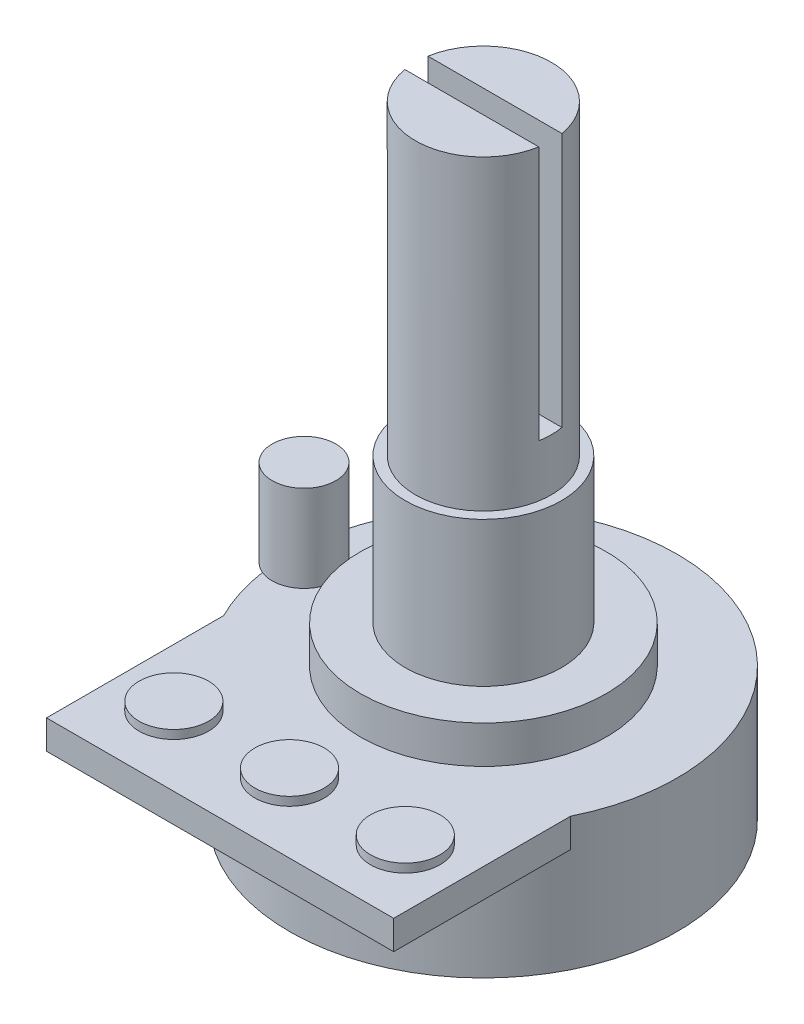
ISO-10303-21;
HEADER;
FILE_DESCRIPTION(('STEP AP214'),'2;1');
FILE_NAME('part.step','',(''),(''),'','','');
FILE_SCHEMA(('AUTOMOTIVE_DESIGN { 1 0 10303 214 1 1 1 1 }'));
ENDSEC;
DATA;
#1=APPLICATION_CONTEXT('core data for automotive mechanical design processes');
#2=APPLICATION_PROTOCOL_DEFINITION('international standard','automotive_design',2000,#1);
#3=PRODUCT_CONTEXT('',#1,'mechanical');
#4=PRODUCT('Part','Part','',(#3));
#5=PRODUCT_RELATED_PRODUCT_CATEGORY('part','',(#4));
#6=PRODUCT_DEFINITION_FORMATION('','',#4);
#7=PRODUCT_DEFINITION_CONTEXT('part definition',#1,'design');
#8=PRODUCT_DEFINITION('design','',#6,#7);
#9=PRODUCT_DEFINITION_SHAPE('','',#8);
#10=(LENGTH_UNIT() NAMED_UNIT(*) SI_UNIT(.MILLI.,.METRE.));
#11=(NAMED_UNIT(*) PLANE_ANGLE_UNIT() SI_UNIT($,.RADIAN.));
#12=(NAMED_UNIT(*) SI_UNIT($,.STERADIAN.) SOLID_ANGLE_UNIT());
#13=UNCERTAINTY_MEASURE_WITH_UNIT(LENGTH_MEASURE(1.E-05),#10,'distance_accuracy_value','');
#14=(GEOMETRIC_REPRESENTATION_CONTEXT(3) GLOBAL_UNCERTAINTY_ASSIGNED_CONTEXT((#13)) GLOBAL_UNIT_ASSIGNED_CONTEXT((#10,
#11,#12)) REPRESENTATION_CONTEXT('',''));
#15=CARTESIAN_POINT('',(0.,0.,0.));
#16=DIRECTION('',(0.,0.,1.));
#17=DIRECTION('',(1.,0.,0.));
#18=AXIS2_PLACEMENT_3D('',#15,#16,#17);
#19=CARTESIAN_POINT('',(0.,-7.493,0.));
#20=DIRECTION('',(0.,1.,0.));
#21=DIRECTION('',(0.,0.,1.));
#22=AXIS2_PLACEMENT_3D('',#19,#20,#21);
#23=CYLINDRICAL_SURFACE('',#22,8.509);
#24=CARTESIAN_POINT('',(0.,-7.493,0.));
#25=DIRECTION('',(0.,-1.,0.));
#26=DIRECTION('',(0.,0.,-1.));
#27=AXIS2_PLACEMENT_3D('',#24,#25,#26);
#28=CIRCLE('',#27,8.509);
#29=CARTESIAN_POINT('',(0.,-7.493,-8.509));
#30=VERTEX_POINT('',#29);
#31=EDGE_CURVE('E289',#30,#30,#28,.T.);
#32=ORIENTED_EDGE('',*,*,#31,.F.);
#33=EDGE_LOOP('',(#32));
#34=FACE_BOUND('',#33,.T.);
#35=DIRECTION('',(0.,-1.,0.));
#36=VECTOR('',#35,1.);
#37=CARTESIAN_POINT('',(4.82933360917362,-3.1115,7.00575605422471));
#38=LINE('',#37,#36);
#39=CARTESIAN_POINT('',(4.82933360917361,-3.302,7.00575605422471));
#40=VERTEX_POINT('',#39);
#41=CARTESIAN_POINT('',(4.82933360917362,-2.921,7.00575605422471));
#42=VERTEX_POINT('',#41);
#43=EDGE_CURVE('E199',#40,#42,#38,.F.);
#44=ORIENTED_EDGE('',*,*,#43,.F.);
#45=CARTESIAN_POINT('',(0.,-3.302,0.));
#46=DIRECTION('',(0.,1.,0.));
#47=DIRECTION('',(0.,0.,1.));
#48=AXIS2_PLACEMENT_3D('',#45,#46,#47);
#49=CIRCLE('',#48,8.509);
#50=CARTESIAN_POINT('',(3.87566228506189,-3.302,7.57511206861977));
#51=VERTEX_POINT('',#50);
#52=EDGE_CURVE('E46',#51,#40,#49,.T.);
#53=ORIENTED_EDGE('',*,*,#52,.F.);
#54=DIRECTION('',(0.,-1.,0.));
#55=VECTOR('',#54,1.);
#56=CARTESIAN_POINT('',(3.87566228506189,-3.1115,7.57511206861977));
#57=LINE('',#56,#55);
#58=CARTESIAN_POINT('',(3.87566228506189,-2.921,7.57511206861977));
#59=VERTEX_POINT('',#58);
#60=EDGE_CURVE('E197',#59,#51,#57,.T.);
#61=ORIENTED_EDGE('',*,*,#60,.F.);
#62=CARTESIAN_POINT('',(0.,-2.921,0.));
#63=DIRECTION('',(0.,-1.,0.));
#64=DIRECTION('',(0.,0.,-1.));
#65=AXIS2_PLACEMENT_3D('',#62,#63,#64);
#66=CIRCLE('',#65,8.509);
#67=CARTESIAN_POINT('',(1.51787676095231,-2.921,8.3725223880597));
#68=VERTEX_POINT('',#67);
#69=EDGE_CURVE('E306',#59,#68,#66,.T.);
#70=ORIENTED_EDGE('',*,*,#69,.T.);
#71=DIRECTION('',(0.,-1.,0.));
#72=VECTOR('',#71,1.);
#73=CARTESIAN_POINT('',(1.51787676095231,-3.1115,8.3725223880597));
#74=LINE('',#73,#72);
#75=CARTESIAN_POINT('',(1.51787676095231,-3.302,8.3725223880597));
#76=VERTEX_POINT('',#75);
#77=EDGE_CURVE('E206',#76,#68,#74,.F.);
#78=ORIENTED_EDGE('',*,*,#77,.F.);
#79=CARTESIAN_POINT('',(0.,-3.302,0.));
#80=DIRECTION('',(0.,1.,0.));
#81=DIRECTION('',(0.,0.,1.));
#82=AXIS2_PLACEMENT_3D('',#79,#80,#81);
#83=CIRCLE('',#82,8.509);
#84=CARTESIAN_POINT('',(-1.51787676095231,-3.302,8.3725223880597));
#85=VERTEX_POINT('',#84);
#86=EDGE_CURVE('E320',#85,#76,#83,.T.);
#87=ORIENTED_EDGE('',*,*,#86,.F.);
#88=DIRECTION('',(0.,-1.,0.));
#89=VECTOR('',#88,1.);
#90=CARTESIAN_POINT('',(-1.51787676095231,-3.1115,8.3725223880597));
#91=LINE('',#90,#89);
#92=CARTESIAN_POINT('',(-1.51787676095231,-2.921,8.3725223880597));
#93=VERTEX_POINT('',#92);
#94=EDGE_CURVE('E204',#93,#85,#91,.T.);
#95=ORIENTED_EDGE('',*,*,#94,.F.);
#96=CARTESIAN_POINT('',(-3.87566228506189,-2.921,7.57511206861977));
#97=VERTEX_POINT('',#96);
#98=EDGE_CURVE('E349',#93,#97,#66,.T.);
#99=ORIENTED_EDGE('',*,*,#98,.T.);
#100=DIRECTION('',(0.,-1.,0.));
#101=VECTOR('',#100,1.);
#102=CARTESIAN_POINT('',(-3.87566228506189,-2.286,7.57511206861977));
#103=LINE('',#102,#101);
#104=CARTESIAN_POINT('',(-3.87566228506189,-3.302,7.57511206861977));
#105=VERTEX_POINT('',#104);
#106=EDGE_CURVE('E223',#105,#97,#103,.F.);
#107=ORIENTED_EDGE('',*,*,#106,.F.);
#108=CARTESIAN_POINT('',(0.,-3.302,0.));
#109=DIRECTION('',(0.,1.,0.));
#110=DIRECTION('',(0.,0.,1.));
#111=AXIS2_PLACEMENT_3D('',#108,#109,#110);
#112=CIRCLE('',#111,8.509);
#113=CARTESIAN_POINT('',(-4.82933360917362,-3.302,7.00575605422471));
#114=VERTEX_POINT('',#113);
#115=EDGE_CURVE('E230',#114,#105,#112,.T.);
#116=ORIENTED_EDGE('',*,*,#115,.F.);
#117=DIRECTION('',(0.,-1.,0.));
#118=VECTOR('',#117,1.);
#119=CARTESIAN_POINT('',(-4.82933360917362,-2.286,7.00575605422471));
#120=LINE('',#119,#118);
#121=CARTESIAN_POINT('',(-4.82933360917362,-2.921,7.00575605422471));
#122=VERTEX_POINT('',#121);
#123=EDGE_CURVE('E219',#122,#114,#120,.T.);
#124=ORIENTED_EDGE('',*,*,#123,.F.);
#125=CARTESIAN_POINT('',(-7.62,-2.921,3.7866450850324));
#126=VERTEX_POINT('',#125);
#127=EDGE_CURVE('E307',#122,#126,#66,.T.);
#128=ORIENTED_EDGE('',*,*,#127,.T.);
#129=DIRECTION('',(0.,1.,0.));
#130=VECTOR('',#129,1.);
#131=CARTESIAN_POINT('',(-7.62,-7.493,3.7866450850324));
#132=LINE('',#131,#130);
#133=CARTESIAN_POINT('',(-7.62,-1.651,3.7866450850324));
#134=VERTEX_POINT('',#133);
#135=EDGE_CURVE('E254',#134,#126,#132,.F.);
#136=ORIENTED_EDGE('',*,*,#135,.F.);
#137=CARTESIAN_POINT('',(0.,-1.651,0.));
#138=DIRECTION('',(0.,-1.,0.));
#139=DIRECTION('',(0.,0.,-1.));
#140=AXIS2_PLACEMENT_3D('',#137,#138,#139);
#141=CIRCLE('',#140,8.509);
#142=CARTESIAN_POINT('',(-8.41067741935484,-1.651,1.28980089453939));
#143=VERTEX_POINT('',#142);
#144=EDGE_CURVE('E160',#134,#143,#141,.T.);
#145=ORIENTED_EDGE('',*,*,#144,.T.);
#146=CARTESIAN_POINT('',(-8.41067741935484,-1.651,-1.2898008945394));
#147=VERTEX_POINT('',#146);
#148=EDGE_CURVE('E155',#143,#147,#141,.T.);
#149=ORIENTED_EDGE('',*,*,#148,.T.);
#150=CARTESIAN_POINT('',(7.62,-1.651,3.7866450850324));
#151=VERTEX_POINT('',#150);
#152=EDGE_CURVE('E157',#147,#151,#141,.T.);
#153=ORIENTED_EDGE('',*,*,#152,.T.);
#154=DIRECTION('',(0.,1.,0.));
#155=VECTOR('',#154,1.);
#156=CARTESIAN_POINT('',(7.62,-7.493,3.7866450850324));
#157=LINE('',#156,#155);
#158=CARTESIAN_POINT('',(7.62,-2.921,3.7866450850324));
#159=VERTEX_POINT('',#158);
#160=EDGE_CURVE('E252',#159,#151,#157,.T.);
#161=ORIENTED_EDGE('',*,*,#160,.F.);
#162=EDGE_CURVE('E303',#159,#42,#66,.T.);
#163=ORIENTED_EDGE('',*,*,#162,.T.);
#164=EDGE_LOOP('',(#44,#53,#61,#70,#78,#87,#95,#99,#107,#116,#124,#128,#136,#145,#149,#153,#161,#163));
#165=FACE_BOUND('',#164,.T.);
#166=ADVANCED_FACE('F38',(#34,#165),#23,.T.);
#167=CARTESIAN_POINT('',(0.,19.812,0.));
#168=DIRECTION('',(0.,1.,0.));
#169=DIRECTION('',(0.,0.,1.));
#170=AXIS2_PLACEMENT_3D('',#167,#168,#169);
#171=PLANE('',#170);
#172=DIRECTION('',(-1.,0.,0.));
#173=VECTOR('',#172,1.);
#174=CARTESIAN_POINT('',(0.,19.812,-0.508));
#175=LINE('',#174,#173);
#176=CARTESIAN_POINT('',(2.94094818893497,19.812,-0.508000000000094));
#177=VERTEX_POINT('',#176);
#178=CARTESIAN_POINT('',(-2.94094818893501,19.812,-0.507999999999905));
#179=VERTEX_POINT('',#178);
#180=EDGE_CURVE('E298',#177,#179,#175,.T.);
#181=ORIENTED_EDGE('',*,*,#180,.F.);
#182=CARTESIAN_POINT('',(0.,19.812,0.));
#183=DIRECTION('',(0.,1.,0.));
#184=DIRECTION('',(0.,0.,1.));
#185=AXIS2_PLACEMENT_3D('',#182,#183,#184);
#186=CIRCLE('',#185,2.9845);
#187=EDGE_CURVE('E278',#177,#179,#186,.T.);
#188=ORIENTED_EDGE('',*,*,#187,.T.);
#189=EDGE_LOOP('',(#181,#188));
#190=FACE_BOUND('',#189,.T.);
#191=ADVANCED_FACE('F365',(#190),#171,.T.);
#192=CARTESIAN_POINT('',(0.,-1.651,0.));
#193=DIRECTION('',(0.,1.,0.));
#194=DIRECTION('',(0.,0.,1.));
#195=AXIS2_PLACEMENT_3D('',#192,#193,#194);
#196=CYLINDRICAL_SURFACE('',#195,5.3975);
#197=CARTESIAN_POINT('',(0.,-1.651,0.));
#198=DIRECTION('',(0.,1.,0.));
#199=DIRECTION('',(0.,0.,1.));
#200=AXIS2_PLACEMENT_3D('',#197,#198,#199);
#201=CIRCLE('',#200,5.3975);
#202=CARTESIAN_POINT('',(0.,-1.651,5.3975));
#203=VERTEX_POINT('',#202);
#204=EDGE_CURVE('E291',#203,#203,#201,.T.);
#205=CARTESIAN_POINT('',(0.,0.,0.));
#206=DIRECTION('',(0.,1.,0.));
#207=DIRECTION('',(0.,0.,1.));
#208=AXIS2_PLACEMENT_3D('',#205,#206,#207);
#209=CIRCLE('',#208,5.3975);
#210=CARTESIAN_POINT('',(0.,0.,5.3975));
#211=VERTEX_POINT('',#210);
#212=EDGE_CURVE('E288',#211,#211,#209,.T.);
#213=CARTESIAN_POINT('',(0.,-1.651,5.3975));
#214=CARTESIAN_POINT('',(0.,-1.63380208333333,5.3975));
#215=CARTESIAN_POINT('',(0.,-1.61660416666667,5.3975));
#216=CARTESIAN_POINT('',(0.,-1.58220833333333,5.3975));
#217=CARTESIAN_POINT('',(0.,-1.56501041666667,5.3975));
#218=CARTESIAN_POINT('',(0.,-1.53061458333333,5.3975));
#219=CARTESIAN_POINT('',(0.,-1.51341666666667,5.3975));
#220=CARTESIAN_POINT('',(0.,-1.47902083333333,5.3975));
#221=CARTESIAN_POINT('',(0.,-1.46182291666667,5.3975));
#222=CARTESIAN_POINT('',(0.,-1.42742708333333,5.3975));
#223=CARTESIAN_POINT('',(0.,-1.41022916666667,5.3975));
#224=CARTESIAN_POINT('',(0.,-1.37583333333333,5.3975));
#225=CARTESIAN_POINT('',(0.,-1.35863541666667,5.3975));
#226=CARTESIAN_POINT('',(0.,-1.32423958333333,5.3975));
#227=CARTESIAN_POINT('',(0.,-1.30704166666667,5.3975));
#228=CARTESIAN_POINT('',(0.,-1.27264583333333,5.3975));
#229=CARTESIAN_POINT('',(0.,-1.25544791666667,5.3975));
#230=CARTESIAN_POINT('',(0.,-1.22105208333333,5.3975));
#231=CARTESIAN_POINT('',(0.,-1.20385416666667,5.3975));
#232=CARTESIAN_POINT('',(0.,-1.16945833333333,5.3975));
#233=CARTESIAN_POINT('',(0.,-1.15226041666667,5.3975));
#234=CARTESIAN_POINT('',(0.,-1.11786458333333,5.3975));
#235=CARTESIAN_POINT('',(0.,-1.10066666666667,5.3975));
#236=CARTESIAN_POINT('',(0.,-1.06627083333333,5.3975));
#237=CARTESIAN_POINT('',(0.,-1.04907291666667,5.3975));
#238=CARTESIAN_POINT('',(0.,-1.01467708333333,5.3975));
#239=CARTESIAN_POINT('',(0.,-0.997479166666667,5.3975));
#240=CARTESIAN_POINT('',(0.,-0.963083333333333,5.3975));
#241=CARTESIAN_POINT('',(0.,-0.945885416666667,5.3975));
#242=CARTESIAN_POINT('',(0.,-0.911489583333333,5.3975));
#243=CARTESIAN_POINT('',(0.,-0.894291666666667,5.3975));
#244=CARTESIAN_POINT('',(0.,-0.859895833333333,5.3975));
#245=CARTESIAN_POINT('',(0.,-0.842697916666667,5.3975));
#246=CARTESIAN_POINT('',(0.,-0.808302083333333,5.3975));
#247=CARTESIAN_POINT('',(0.,-0.791104166666667,5.3975));
#248=CARTESIAN_POINT('',(0.,-0.756708333333333,5.3975));
#249=CARTESIAN_POINT('',(0.,-0.739510416666667,5.3975));
#250=CARTESIAN_POINT('',(0.,-0.705114583333333,5.3975));
#251=CARTESIAN_POINT('',(0.,-0.687916666666667,5.3975));
#252=CARTESIAN_POINT('',(0.,-0.653520833333333,5.3975));
#253=CARTESIAN_POINT('',(0.,-0.636322916666667,5.3975));
#254=CARTESIAN_POINT('',(0.,-0.601927083333333,5.3975));
#255=CARTESIAN_POINT('',(0.,-0.584729166666667,5.3975));
#256=CARTESIAN_POINT('',(0.,-0.550333333333333,5.3975));
#257=CARTESIAN_POINT('',(0.,-0.533135416666667,5.3975));
#258=CARTESIAN_POINT('',(0.,-0.498739583333333,5.3975));
#259=CARTESIAN_POINT('',(0.,-0.481541666666667,5.3975));
#260=CARTESIAN_POINT('',(0.,-0.447145833333333,5.3975));
#261=CARTESIAN_POINT('',(0.,-0.429947916666667,5.3975));
#262=CARTESIAN_POINT('',(0.,-0.395552083333333,5.3975));
#263=CARTESIAN_POINT('',(0.,-0.378354166666667,5.3975));
#264=CARTESIAN_POINT('',(0.,-0.343958333333333,5.3975));
#265=CARTESIAN_POINT('',(0.,-0.326760416666667,5.3975));
#266=CARTESIAN_POINT('',(0.,-0.292364583333333,5.3975));
#267=CARTESIAN_POINT('',(0.,-0.275166666666667,5.3975));
#268=CARTESIAN_POINT('',(0.,-0.240770833333333,5.3975));
#269=CARTESIAN_POINT('',(0.,-0.223572916666667,5.3975));
#270=CARTESIAN_POINT('',(0.,-0.189177083333333,5.3975));
#271=CARTESIAN_POINT('',(0.,-0.171979166666667,5.3975));
#272=CARTESIAN_POINT('',(0.,-0.137583333333333,5.3975));
#273=CARTESIAN_POINT('',(0.,-0.120385416666667,5.3975));
#274=CARTESIAN_POINT('',(0.,-0.0859895833333333,5.3975));
#275=CARTESIAN_POINT('',(0.,-0.0687916666666667,5.3975));
#276=CARTESIAN_POINT('',(0.,-0.0343958333333333,5.3975));
#277=CARTESIAN_POINT('',(0.,-0.0171979166666666,5.3975));
#278=CARTESIAN_POINT('',(0.,0.,5.3975));
#279=B_SPLINE_CURVE_WITH_KNOTS('',3,(#213,#214,#215,#216,#217,#218,#219,#220,#221,#222,#223,
#224,#225,#226,#227,#228,#229,#230,#231,#232,#233,#234,#235,#236,#237,#238,#239,#240,#241,#242,
#243,#244,#245,#246,#247,#248,#249,#250,#251,#252,#253,#254,#255,#256,#257,#258,#259,#260,#261,
#262,#263,#264,#265,#266,#267,#268,#269,#270,#271,#272,#273,#274,#275,#276,#277,#278),
.UNSPECIFIED.,.F.,.F.,(4,2,2,2,2,2,2,2,2,2,2,2,2,2,2,2,2,2,2,2,2,2,2,2,2,2,2,2,2,2,2,2,4),(0.,
0.05159375,0.1031875,0.15478125,0.206375,0.25796875,0.3095625,0.36115625,0.41275,0.46434375,
0.5159375,0.56753125,0.619125,0.67071875,0.7223125,0.77390625,0.8255,0.87709375,0.9286875,
0.98028125,1.031875,1.08346875,1.1350625,1.18665625,1.23825,1.28984375,1.3414375,1.39303125,
1.444625,1.49621875,1.5478125,1.59940625,1.651),.UNSPECIFIED.);
#280=EDGE_CURVE('BSEAM40',#203,#211,#279,.T.);
#281=ORIENTED_EDGE('',*,*,#204,.T.);
#282=ORIENTED_EDGE('',*,*,#212,.F.);
#283=ORIENTED_EDGE('',*,*,#280,.T.);
#284=ORIENTED_EDGE('',*,*,#280,.F.);
#285=EDGE_LOOP('',(#281,#283,#282,#284));
#286=FACE_BOUND('',#285,.T.);
#287=ADVANCED_FACE('F40',(#286),#196,.T.);
#288=CARTESIAN_POINT('',(0.,0.,0.));
#289=DIRECTION('',(0.,1.,0.));
#290=DIRECTION('',(0.,0.,1.));
#291=AXIS2_PLACEMENT_3D('',#288,#289,#290);
#292=PLANE('',#291);
#293=CARTESIAN_POINT('',(0.,0.,0.));
#294=DIRECTION('',(0.,1.,0.));
#295=DIRECTION('',(0.,0.,1.));
#296=AXIS2_PLACEMENT_3D('',#293,#294,#295);
#297=CIRCLE('',#296,3.429);
#298=CARTESIAN_POINT('',(0.,0.,3.429));
#299=VERTEX_POINT('',#298);
#300=EDGE_CURVE('E283',#299,#299,#297,.T.);
#301=ORIENTED_EDGE('',*,*,#300,.F.);
#302=EDGE_LOOP('',(#301));
#303=FACE_BOUND('',#302,.T.);
#304=ORIENTED_EDGE('',*,*,#212,.T.);
#305=EDGE_LOOP('',(#304));
#306=FACE_BOUND('',#305,.T.);
#307=ADVANCED_FACE('F373',(#303,#306),#292,.T.);
#308=CARTESIAN_POINT('',(0.,-7.493,0.));
#309=DIRECTION('',(0.,-1.,0.));
#310=DIRECTION('',(0.,0.,-1.));
#311=AXIS2_PLACEMENT_3D('',#308,#309,#310);
#312=PLANE('',#311);
#313=ORIENTED_EDGE('',*,*,#31,.T.);
#314=EDGE_LOOP('',(#313));
#315=FACE_BOUND('',#314,.T.);
#316=ADVANCED_FACE('F584',(#315),#312,.T.);
#317=CARTESIAN_POINT('',(0.,-1.651,0.));
#318=DIRECTION('',(0.,-1.,0.));
#319=DIRECTION('',(0.,0.,-1.));
#320=AXIS2_PLACEMENT_3D('',#317,#318,#319);
#321=PLANE('',#320);
#322=CARTESIAN_POINT('',(-7.874,-1.651,0.));
#323=DIRECTION('',(0.,-1.,0.));
#324=DIRECTION('',(0.,0.,-1.));
#325=AXIS2_PLACEMENT_3D('',#322,#323,#324);
#326=CIRCLE('',#325,1.397);
#327=EDGE_CURVE('E11',#143,#147,#326,.F.);
#328=ORIENTED_EDGE('',*,*,#327,.F.);
#329=ORIENTED_EDGE('',*,*,#144,.F.);
#330=DIRECTION('',(0.,0.,-1.));
#331=VECTOR('',#330,1.);
#332=CARTESIAN_POINT('',(-7.62,-1.651,3.175));
#333=LINE('',#332,#331);
#334=CARTESIAN_POINT('',(-7.62,-1.651,11.557));
#335=VERTEX_POINT('',#334);
#336=EDGE_CURVE('E243',#335,#134,#333,.T.);
#337=ORIENTED_EDGE('',*,*,#336,.F.);
#338=DIRECTION('',(-1.,0.,0.));
#339=VECTOR('',#338,1.);
#340=CARTESIAN_POINT('',(-7.62,-1.651,11.557));
#341=LINE('',#340,#339);
#342=CARTESIAN_POINT('',(7.62,-1.651,11.557));
#343=VERTEX_POINT('',#342);
#344=EDGE_CURVE('E226',#343,#335,#341,.T.);
#345=ORIENTED_EDGE('',*,*,#344,.F.);
#346=DIRECTION('',(0.,0.,1.));
#347=VECTOR('',#346,1.);
#348=CARTESIAN_POINT('',(7.62,-1.651,11.557));
#349=LINE('',#348,#347);
#350=EDGE_CURVE('E169',#151,#343,#349,.T.);
#351=ORIENTED_EDGE('',*,*,#350,.F.);
#352=ORIENTED_EDGE('',*,*,#152,.F.);
#353=EDGE_LOOP('',(#328,#329,#337,#345,#351,#352));
#354=FACE_BOUND('',#353,.T.);
#355=CARTESIAN_POINT('',(5.08,-1.651,8.509));
#356=DIRECTION('',(0.,-1.,0.));
#357=DIRECTION('',(0.,0.,-1.));
#358=AXIS2_PLACEMENT_3D('',#355,#356,#357);
#359=CIRCLE('',#358,1.524);
#360=CARTESIAN_POINT('',(5.08,-1.651,6.985));
#361=VERTEX_POINT('',#360);
#362=EDGE_CURVE('E314',#361,#361,#359,.F.);
#363=ORIENTED_EDGE('',*,*,#362,.F.);
#364=EDGE_LOOP('',(#363));
#365=FACE_BOUND('',#364,.T.);
#366=CARTESIAN_POINT('',(0.,-1.651,8.509));
#367=DIRECTION('',(0.,-1.,0.));
#368=DIRECTION('',(0.,0.,-1.));
#369=AXIS2_PLACEMENT_3D('',#366,#367,#368);
#370=CIRCLE('',#369,1.524);
#371=CARTESIAN_POINT('',(0.,-1.651,6.985));
#372=VERTEX_POINT('',#371);
#373=EDGE_CURVE('E311',#372,#372,#370,.F.);
#374=ORIENTED_EDGE('',*,*,#373,.F.);
#375=EDGE_LOOP('',(#374));
#376=FACE_BOUND('',#375,.T.);
#377=CARTESIAN_POINT('',(-5.08,-1.651,8.509));
#378=DIRECTION('',(0.,-1.,0.));
#379=DIRECTION('',(0.,0.,-1.));
#380=AXIS2_PLACEMENT_3D('',#377,#378,#379);
#381=CIRCLE('',#380,1.524);
#382=CARTESIAN_POINT('',(-5.08,-1.651,6.985));
#383=VERTEX_POINT('',#382);
#384=EDGE_CURVE('E227',#383,#383,#381,.F.);
#385=ORIENTED_EDGE('',*,*,#384,.F.);
#386=EDGE_LOOP('',(#385));
#387=FACE_BOUND('',#386,.T.);
#388=ORIENTED_EDGE('',*,*,#204,.F.);
#389=EDGE_LOOP('',(#388));
#390=FACE_BOUND('',#389,.T.);
#391=ADVANCED_FACE('F166',(#354,#365,#376,#387,#390),#321,.F.);
#392=CARTESIAN_POINT('',(0.,6.35,0.));
#393=DIRECTION('',(0.,-1.,0.));
#394=DIRECTION('',(0.,0.,-1.));
#395=AXIS2_PLACEMENT_3D('',#392,#393,#394);
#396=CYLINDRICAL_SURFACE('',#395,3.429);
#397=CARTESIAN_POINT('',(0.,6.35,0.));
#398=DIRECTION('',(0.,1.,0.));
#399=DIRECTION('',(0.,0.,1.));
#400=AXIS2_PLACEMENT_3D('',#397,#398,#399);
#401=CIRCLE('',#400,3.429);
#402=CARTESIAN_POINT('',(0.,6.35,3.429));
#403=VERTEX_POINT('',#402);
#404=EDGE_CURVE('E170',#403,#403,#401,.T.);
#405=ORIENTED_EDGE('',*,*,#404,.F.);
#406=EDGE_LOOP('',(#405));
#407=FACE_BOUND('',#406,.T.);
#408=ORIENTED_EDGE('',*,*,#300,.T.);
#409=EDGE_LOOP('',(#408));
#410=FACE_BOUND('',#409,.T.);
#411=ADVANCED_FACE('F583',(#407,#410),#396,.T.);
#412=CARTESIAN_POINT('',(0.,6.35,0.));
#413=DIRECTION('',(0.,1.,0.));
#414=DIRECTION('',(0.,0.,1.));
#415=AXIS2_PLACEMENT_3D('',#412,#413,#414);
#416=PLANE('',#415);
#417=CARTESIAN_POINT('',(0.,6.35,0.));
#418=DIRECTION('',(0.,1.,0.));
#419=DIRECTION('',(0.,0.,1.));
#420=AXIS2_PLACEMENT_3D('',#417,#418,#419);
#421=CIRCLE('',#420,2.9845);
#422=CARTESIAN_POINT('',(0.,6.35,2.9845));
#423=VERTEX_POINT('',#422);
#424=EDGE_CURVE('E279',#423,#423,#421,.T.);
#425=ORIENTED_EDGE('',*,*,#424,.F.);
#426=EDGE_LOOP('',(#425));
#427=FACE_BOUND('',#426,.T.);
#428=ORIENTED_EDGE('',*,*,#404,.T.);
#429=EDGE_LOOP('',(#428));
#430=FACE_BOUND('',#429,.T.);
#431=ADVANCED_FACE('F386',(#427,#430),#416,.T.);
#432=CARTESIAN_POINT('',(0.,19.812,0.));
#433=DIRECTION('',(0.,-1.,0.));
#434=DIRECTION('',(0.,0.,-1.));
#435=AXIS2_PLACEMENT_3D('',#432,#433,#434);
#436=CYLINDRICAL_SURFACE('',#435,2.9845);
#437=ORIENTED_EDGE('',*,*,#187,.F.);
#438=DIRECTION('',(0.,-1.,0.));
#439=VECTOR('',#438,1.);
#440=CARTESIAN_POINT('',(2.94094818893497,19.812,-0.508000000000094));
#441=LINE('',#440,#439);
#442=CARTESIAN_POINT('',(2.94094818893497,8.636,-0.508000000000094));
#443=VERTEX_POINT('',#442);
#444=EDGE_CURVE('E272',#177,#443,#441,.T.);
#445=ORIENTED_EDGE('',*,*,#444,.T.);
#446=CARTESIAN_POINT('',(0.,8.636,0.));
#447=DIRECTION('',(0.,1.,0.));
#448=DIRECTION('',(0.,0.,1.));
#449=AXIS2_PLACEMENT_3D('',#446,#447,#448);
#450=CIRCLE('',#449,2.9845);
#451=CARTESIAN_POINT('',(2.94094818893501,8.636,0.507999999999906));
#452=VERTEX_POINT('',#451);
#453=EDGE_CURVE('E302',#452,#443,#450,.T.);
#454=ORIENTED_EDGE('',*,*,#453,.F.);
#455=DIRECTION('',(0.,-1.,0.));
#456=VECTOR('',#455,1.);
#457=CARTESIAN_POINT('',(2.94094818893501,19.812,0.507999999999906));
#458=LINE('',#457,#456);
#459=CARTESIAN_POINT('',(2.94094818893501,19.812,0.507999999999906));
#460=VERTEX_POINT('',#459);
#461=EDGE_CURVE('E263',#452,#460,#458,.F.);
#462=ORIENTED_EDGE('',*,*,#461,.T.);
#463=CARTESIAN_POINT('',(-2.94094818893497,19.812,0.508000000000094));
#464=VERTEX_POINT('',#463);
#465=EDGE_CURVE('E275',#464,#460,#186,.T.);
#466=ORIENTED_EDGE('',*,*,#465,.F.);
#467=DIRECTION('',(0.,-1.,0.));
#468=VECTOR('',#467,1.);
#469=CARTESIAN_POINT('',(-2.94094818893497,19.812,0.508000000000094));
#470=LINE('',#469,#468);
#471=CARTESIAN_POINT('',(-2.94094818893497,8.636,0.508000000000094));
#472=VERTEX_POINT('',#471);
#473=EDGE_CURVE('E266',#464,#472,#470,.T.);
#474=ORIENTED_EDGE('',*,*,#473,.T.);
#475=CARTESIAN_POINT('',(-2.94094818893501,8.636,-0.507999999999905));
#476=VERTEX_POINT('',#475);
#477=EDGE_CURVE('E300',#476,#472,#450,.T.);
#478=ORIENTED_EDGE('',*,*,#477,.F.);
#479=DIRECTION('',(0.,-1.,0.));
#480=VECTOR('',#479,1.);
#481=CARTESIAN_POINT('',(-2.94094818893501,19.812,-0.507999999999905));
#482=LINE('',#481,#480);
#483=EDGE_CURVE('E269',#476,#179,#482,.F.);
#484=ORIENTED_EDGE('',*,*,#483,.T.);
#485=EDGE_LOOP('',(#437,#445,#454,#462,#466,#474,#478,#484));
#486=FACE_BOUND('',#485,.T.);
#487=ORIENTED_EDGE('',*,*,#424,.T.);
#488=EDGE_LOOP('',(#487));
#489=FACE_BOUND('',#488,.T.);
#490=ADVANCED_FACE('F361',(#486,#489),#436,.T.);
#491=DIRECTION('',(1.,0.,0.));
#492=VECTOR('',#491,1.);
#493=CARTESIAN_POINT('',(0.,19.812,0.508));
#494=LINE('',#493,#492);
#495=EDGE_CURVE('E282',#464,#460,#494,.T.);
#496=ORIENTED_EDGE('',*,*,#495,.F.);
#497=ORIENTED_EDGE('',*,*,#465,.T.);
#498=EDGE_LOOP('',(#496,#497));
#499=FACE_BOUND('',#498,.T.);
#500=ADVANCED_FACE('F368',(#499),#171,.T.);
#501=CARTESIAN_POINT('',(0.,8.636,0.));
#502=DIRECTION('',(0.,1.,0.));
#503=DIRECTION('',(0.,0.,1.));
#504=AXIS2_PLACEMENT_3D('',#501,#502,#503);
#505=PLANE('',#504);
#506=ORIENTED_EDGE('',*,*,#453,.T.);
#507=DIRECTION('',(-1.,0.,0.));
#508=VECTOR('',#507,1.);
#509=CARTESIAN_POINT('',(-3.17500000000002,8.636,-0.507999999999898));
#510=LINE('',#509,#508);
#511=EDGE_CURVE('E257',#443,#476,#510,.T.);
#512=ORIENTED_EDGE('',*,*,#511,.T.);
#513=ORIENTED_EDGE('',*,*,#477,.T.);
#514=DIRECTION('',(1.,0.,0.));
#515=VECTOR('',#514,1.);
#516=CARTESIAN_POINT('',(-3.17499999999998,8.636,0.508000000000102));
#517=LINE('',#516,#515);
#518=EDGE_CURVE('E260',#472,#452,#517,.T.);
#519=ORIENTED_EDGE('',*,*,#518,.T.);
#520=EDGE_LOOP('',(#506,#512,#513,#519));
#521=FACE_BOUND('',#520,.T.);
#522=ADVANCED_FACE('F353',(#521),#505,.T.);
#523=CARTESIAN_POINT('',(-3.17500000000002,8.636,-0.507999999999898));
#524=DIRECTION('',(0.,0.,-1.));
#525=DIRECTION('',(-1.,0.,0.));
#526=AXIS2_PLACEMENT_3D('',#523,#524,#525);
#527=PLANE('',#526);
#528=ORIENTED_EDGE('',*,*,#180,.T.);
#529=ORIENTED_EDGE('',*,*,#483,.F.);
#530=ORIENTED_EDGE('',*,*,#511,.F.);
#531=ORIENTED_EDGE('',*,*,#444,.F.);
#532=EDGE_LOOP('',(#528,#529,#530,#531));
#533=FACE_BOUND('',#532,.T.);
#534=ADVANCED_FACE('F358',(#533),#527,.F.);
#535=CARTESIAN_POINT('',(-3.17499999999998,8.636,0.508000000000102));
#536=DIRECTION('',(0.,0.,1.));
#537=DIRECTION('',(1.,0.,0.));
#538=AXIS2_PLACEMENT_3D('',#535,#536,#537);
#539=PLANE('',#538);
#540=ORIENTED_EDGE('',*,*,#495,.T.);
#541=ORIENTED_EDGE('',*,*,#461,.F.);
#542=ORIENTED_EDGE('',*,*,#518,.F.);
#543=ORIENTED_EDGE('',*,*,#473,.F.);
#544=EDGE_LOOP('',(#540,#541,#542,#543));
#545=FACE_BOUND('',#544,.T.);
#546=ADVANCED_FACE('F390',(#545),#539,.F.);
#547=CARTESIAN_POINT('',(-7.62,-2.921,3.175));
#548=DIRECTION('',(1.,0.,0.));
#549=DIRECTION('',(0.,0.,-1.));
#550=AXIS2_PLACEMENT_3D('',#547,#548,#549);
#551=PLANE('',#550);
#552=ORIENTED_EDGE('',*,*,#336,.T.);
#553=ORIENTED_EDGE('',*,*,#135,.T.);
#554=DIRECTION('',(0.,0.,-1.));
#555=VECTOR('',#554,1.);
#556=CARTESIAN_POINT('',(-7.62,-2.921,3.175));
#557=LINE('',#556,#555);
#558=CARTESIAN_POINT('',(-7.62,-2.921,11.557));
#559=VERTEX_POINT('',#558);
#560=EDGE_CURVE('E235',#559,#126,#557,.T.);
#561=ORIENTED_EDGE('',*,*,#560,.F.);
#562=DIRECTION('',(0.,1.,0.));
#563=VECTOR('',#562,1.);
#564=CARTESIAN_POINT('',(-7.62,-2.921,11.557));
#565=LINE('',#564,#563);
#566=EDGE_CURVE('E249',#559,#335,#565,.T.);
#567=ORIENTED_EDGE('',*,*,#566,.T.);
#568=EDGE_LOOP('',(#552,#553,#561,#567));
#569=FACE_BOUND('',#568,.T.);
#570=ADVANCED_FACE('F346',(#569),#551,.F.);
#571=CARTESIAN_POINT('',(7.62,-2.921,11.557));
#572=DIRECTION('',(-1.,0.,0.));
#573=DIRECTION('',(0.,0.,1.));
#574=AXIS2_PLACEMENT_3D('',#571,#572,#573);
#575=PLANE('',#574);
#576=DIRECTION('',(0.,0.,1.));
#577=VECTOR('',#576,1.);
#578=CARTESIAN_POINT('',(7.62,-2.921,11.557));
#579=LINE('',#578,#577);
#580=CARTESIAN_POINT('',(7.62,-2.921,11.557));
#581=VERTEX_POINT('',#580);
#582=EDGE_CURVE('E238',#159,#581,#579,.T.);
#583=ORIENTED_EDGE('',*,*,#582,.F.);
#584=ORIENTED_EDGE('',*,*,#160,.T.);
#585=ORIENTED_EDGE('',*,*,#350,.T.);
#586=DIRECTION('',(0.,1.,0.));
#587=VECTOR('',#586,1.);
#588=CARTESIAN_POINT('',(7.62,-2.921,11.557));
#589=LINE('',#588,#587);
#590=EDGE_CURVE('E240',#581,#343,#589,.T.);
#591=ORIENTED_EDGE('',*,*,#590,.F.);
#592=EDGE_LOOP('',(#583,#584,#585,#591));
#593=FACE_BOUND('',#592,.T.);
#594=ADVANCED_FACE('F339',(#593),#575,.F.);
#595=CARTESIAN_POINT('',(-7.62,-2.921,11.557));
#596=DIRECTION('',(0.,0.,-1.));
#597=DIRECTION('',(-1.,0.,0.));
#598=AXIS2_PLACEMENT_3D('',#595,#596,#597);
#599=PLANE('',#598);
#600=ORIENTED_EDGE('',*,*,#344,.T.);
#601=ORIENTED_EDGE('',*,*,#566,.F.);
#602=DIRECTION('',(-1.,0.,0.));
#603=VECTOR('',#602,1.);
#604=CARTESIAN_POINT('',(-7.62,-2.921,11.557));
#605=LINE('',#604,#603);
#606=EDGE_CURVE('E232',#581,#559,#605,.T.);
#607=ORIENTED_EDGE('',*,*,#606,.F.);
#608=ORIENTED_EDGE('',*,*,#590,.T.);
#609=EDGE_LOOP('',(#600,#601,#607,#608));
#610=FACE_BOUND('',#609,.T.);
#611=ADVANCED_FACE('F343',(#610),#599,.F.);
#612=CARTESIAN_POINT('',(0.,-2.921,0.));
#613=DIRECTION('',(0.,-1.,0.));
#614=DIRECTION('',(0.,0.,-1.));
#615=AXIS2_PLACEMENT_3D('',#612,#613,#614);
#616=PLANE('',#615);
#617=CARTESIAN_POINT('',(10.16,-2.921,0.));
#618=DIRECTION('',(0.,-1.,0.));
#619=DIRECTION('',(0.,0.,-1.));
#620=AXIS2_PLACEMENT_3D('',#617,#618,#619);
#621=CIRCLE('',#620,8.509);
#622=CARTESIAN_POINT('',(6.28433771493811,-2.921,7.57511206861977));
#623=VERTEX_POINT('',#622);
#624=CARTESIAN_POINT('',(5.33066639082638,-2.921,7.00575605422471));
#625=VERTEX_POINT('',#624);
#626=EDGE_CURVE('E194',#623,#625,#621,.T.);
#627=ORIENTED_EDGE('',*,*,#626,.T.);
#628=CARTESIAN_POINT('',(5.08,-2.921,8.509));
#629=DIRECTION('',(0.,-1.,0.));
#630=DIRECTION('',(0.,0.,-1.));
#631=AXIS2_PLACEMENT_3D('',#628,#629,#630);
#632=CIRCLE('',#631,1.524);
#633=EDGE_CURVE('E188',#625,#42,#632,.F.);
#634=ORIENTED_EDGE('',*,*,#633,.T.);
#635=ORIENTED_EDGE('',*,*,#162,.F.);
#636=ORIENTED_EDGE('',*,*,#582,.T.);
#637=ORIENTED_EDGE('',*,*,#606,.T.);
#638=ORIENTED_EDGE('',*,*,#560,.T.);
#639=ORIENTED_EDGE('',*,*,#127,.F.);
#640=CARTESIAN_POINT('',(-5.08,-2.921,8.509));
#641=DIRECTION('',(0.,-1.,0.));
#642=DIRECTION('',(0.,0.,-1.));
#643=AXIS2_PLACEMENT_3D('',#640,#641,#642);
#644=CIRCLE('',#643,1.524);
#645=EDGE_CURVE('E231',#122,#97,#644,.F.);
#646=ORIENTED_EDGE('',*,*,#645,.T.);
#647=ORIENTED_EDGE('',*,*,#98,.F.);
#648=CARTESIAN_POINT('',(0.,-2.921,8.509));
#649=DIRECTION('',(0.,-1.,0.));
#650=DIRECTION('',(0.,0.,-1.));
#651=AXIS2_PLACEMENT_3D('',#648,#649,#650);
#652=CIRCLE('',#651,1.524);
#653=EDGE_CURVE('E317',#93,#68,#652,.F.);
#654=ORIENTED_EDGE('',*,*,#653,.T.);
#655=ORIENTED_EDGE('',*,*,#69,.F.);
#656=CARTESIAN_POINT('',(5.08,-2.921,8.509));
#657=DIRECTION('',(0.,-1.,0.));
#658=DIRECTION('',(0.,0.,-1.));
#659=AXIS2_PLACEMENT_3D('',#656,#657,#658);
#660=CIRCLE('',#659,1.524);
#661=EDGE_CURVE('E322',#59,#623,#660,.F.);
#662=ORIENTED_EDGE('',*,*,#661,.T.);
#663=EDGE_LOOP('',(#627,#634,#635,#636,#637,#638,#639,#646,#647,#654,#655,#662));
#664=FACE_BOUND('',#663,.T.);
#665=ADVANCED_FACE('F336',(#664),#616,.T.);
#666=CARTESIAN_POINT('',(-5.08,-1.27,8.509));
#667=DIRECTION('',(0.,-1.,0.));
#668=DIRECTION('',(0.,0.,-1.));
#669=AXIS2_PLACEMENT_3D('',#666,#667,#668);
#670=CYLINDRICAL_SURFACE('',#669,1.524);
#671=CARTESIAN_POINT('',(-5.08,-3.302,8.509));
#672=DIRECTION('',(0.,1.,0.));
#673=DIRECTION('',(0.,0.,1.));
#674=AXIS2_PLACEMENT_3D('',#671,#672,#673);
#675=CIRCLE('',#674,1.524);
#676=EDGE_CURVE('E215',#114,#105,#675,.T.);
#677=ORIENTED_EDGE('',*,*,#676,.T.);
#678=ORIENTED_EDGE('',*,*,#106,.T.);
#679=ORIENTED_EDGE('',*,*,#645,.F.);
#680=ORIENTED_EDGE('',*,*,#123,.T.);
#681=EDGE_LOOP('',(#677,#678,#679,#680));
#682=FACE_BOUND('',#681,.T.);
#683=ADVANCED_FACE('F405',(#682),#670,.T.);
#684=CARTESIAN_POINT('',(-5.08,-3.302,8.509));
#685=DIRECTION('',(0.,1.,0.));
#686=DIRECTION('',(0.,0.,1.));
#687=AXIS2_PLACEMENT_3D('',#684,#685,#686);
#688=PLANE('',#687);
#689=ORIENTED_EDGE('',*,*,#676,.F.);
#690=ORIENTED_EDGE('',*,*,#115,.T.);
#691=EDGE_LOOP('',(#689,#690));
#692=FACE_BOUND('',#691,.T.);
#693=ADVANCED_FACE('F410',(#692),#688,.F.);
#694=CARTESIAN_POINT('',(-5.08,-1.27,8.509));
#695=DIRECTION('',(0.,1.,0.));
#696=DIRECTION('',(0.,0.,1.));
#697=AXIS2_PLACEMENT_3D('',#694,#695,#696);
#698=CIRCLE('',#697,1.524);
#699=CARTESIAN_POINT('',(-5.08,-1.27,10.033));
#700=VERTEX_POINT('',#699);
#701=EDGE_CURVE('E216',#700,#700,#698,.T.);
#702=ORIENTED_EDGE('',*,*,#701,.F.);
#703=EDGE_LOOP('',(#702));
#704=FACE_BOUND('',#703,.T.);
#705=ORIENTED_EDGE('',*,*,#384,.T.);
#706=EDGE_LOOP('',(#705));
#707=FACE_BOUND('',#706,.T.);
#708=ADVANCED_FACE('F406',(#704,#707),#670,.T.);
#709=CARTESIAN_POINT('',(-5.08,-1.27,8.509));
#710=DIRECTION('',(0.,1.,0.));
#711=DIRECTION('',(0.,0.,1.));
#712=AXIS2_PLACEMENT_3D('',#709,#710,#711);
#713=PLANE('',#712);
#714=ORIENTED_EDGE('',*,*,#701,.T.);
#715=EDGE_LOOP('',(#714));
#716=FACE_BOUND('',#715,.T.);
#717=ADVANCED_FACE('F409',(#716),#713,.T.);
#718=CARTESIAN_POINT('',(0.,-1.27,8.509));
#719=DIRECTION('',(0.,-1.,0.));
#720=DIRECTION('',(0.,0.,-1.));
#721=AXIS2_PLACEMENT_3D('',#718,#719,#720);
#722=CYLINDRICAL_SURFACE('',#721,1.524);
#723=CARTESIAN_POINT('',(0.,-1.27,8.509));
#724=DIRECTION('',(0.,1.,0.));
#725=DIRECTION('',(0.,0.,1.));
#726=AXIS2_PLACEMENT_3D('',#723,#724,#725);
#727=CIRCLE('',#726,1.524);
#728=CARTESIAN_POINT('',(0.,-1.27,10.033));
#729=VERTEX_POINT('',#728);
#730=EDGE_CURVE('E212',#729,#729,#727,.T.);
#731=ORIENTED_EDGE('',*,*,#730,.F.);
#732=EDGE_LOOP('',(#731));
#733=FACE_BOUND('',#732,.T.);
#734=ORIENTED_EDGE('',*,*,#373,.T.);
#735=EDGE_LOOP('',(#734));
#736=FACE_BOUND('',#735,.T.);
#737=ADVANCED_FACE('F417',(#733,#736),#722,.T.);
#738=CARTESIAN_POINT('',(0.,-1.27,8.509));
#739=DIRECTION('',(0.,1.,0.));
#740=DIRECTION('',(0.,0.,1.));
#741=AXIS2_PLACEMENT_3D('',#738,#739,#740);
#742=PLANE('',#741);
#743=ORIENTED_EDGE('',*,*,#730,.T.);
#744=EDGE_LOOP('',(#743));
#745=FACE_BOUND('',#744,.T.);
#746=ADVANCED_FACE('F421',(#745),#742,.T.);
#747=CARTESIAN_POINT('',(5.08,-1.27,8.509));
#748=DIRECTION('',(0.,-1.,0.));
#749=DIRECTION('',(0.,0.,-1.));
#750=AXIS2_PLACEMENT_3D('',#747,#748,#749);
#751=CYLINDRICAL_SURFACE('',#750,1.524);
#752=CARTESIAN_POINT('',(5.08,-1.27,8.509));
#753=DIRECTION('',(0.,1.,0.));
#754=DIRECTION('',(0.,0.,1.));
#755=AXIS2_PLACEMENT_3D('',#752,#753,#754);
#756=CIRCLE('',#755,1.524);
#757=CARTESIAN_POINT('',(5.08,-1.27,10.033));
#758=VERTEX_POINT('',#757);
#759=EDGE_CURVE('E209',#758,#758,#756,.T.);
#760=ORIENTED_EDGE('',*,*,#759,.F.);
#761=EDGE_LOOP('',(#760));
#762=FACE_BOUND('',#761,.T.);
#763=ORIENTED_EDGE('',*,*,#362,.T.);
#764=EDGE_LOOP('',(#763));
#765=FACE_BOUND('',#764,.T.);
#766=ADVANCED_FACE('F425',(#762,#765),#751,.T.);
#767=CARTESIAN_POINT('',(5.08,-1.27,8.509));
#768=DIRECTION('',(0.,1.,0.));
#769=DIRECTION('',(0.,0.,1.));
#770=AXIS2_PLACEMENT_3D('',#767,#768,#769);
#771=PLANE('',#770);
#772=ORIENTED_EDGE('',*,*,#759,.T.);
#773=EDGE_LOOP('',(#772));
#774=FACE_BOUND('',#773,.T.);
#775=ADVANCED_FACE('F429',(#774),#771,.T.);
#776=CARTESIAN_POINT('',(0.,-1.27,8.509));
#777=DIRECTION('',(0.,-1.,0.));
#778=DIRECTION('',(0.,0.,-1.));
#779=AXIS2_PLACEMENT_3D('',#776,#777,#778);
#780=CYLINDRICAL_SURFACE('',#779,1.524);
#781=CARTESIAN_POINT('',(0.,-3.302,8.509));
#782=DIRECTION('',(0.,1.,0.));
#783=DIRECTION('',(0.,0.,1.));
#784=AXIS2_PLACEMENT_3D('',#781,#782,#783);
#785=CIRCLE('',#784,1.524);
#786=EDGE_CURVE('E201',#85,#76,#785,.T.);
#787=ORIENTED_EDGE('',*,*,#786,.T.);
#788=ORIENTED_EDGE('',*,*,#77,.T.);
#789=ORIENTED_EDGE('',*,*,#653,.F.);
#790=ORIENTED_EDGE('',*,*,#94,.T.);
#791=EDGE_LOOP('',(#787,#788,#789,#790));
#792=FACE_BOUND('',#791,.T.);
#793=ADVANCED_FACE('F433',(#792),#780,.T.);
#794=CARTESIAN_POINT('',(0.,-3.302,8.509));
#795=DIRECTION('',(0.,1.,0.));
#796=DIRECTION('',(0.,0.,1.));
#797=AXIS2_PLACEMENT_3D('',#794,#795,#796);
#798=PLANE('',#797);
#799=ORIENTED_EDGE('',*,*,#786,.F.);
#800=ORIENTED_EDGE('',*,*,#86,.T.);
#801=EDGE_LOOP('',(#799,#800));
#802=FACE_BOUND('',#801,.T.);
#803=ADVANCED_FACE('F437',(#802),#798,.F.);
#804=CARTESIAN_POINT('',(5.08,-1.27,8.509));
#805=DIRECTION('',(0.,-1.,0.));
#806=DIRECTION('',(0.,0.,-1.));
#807=AXIS2_PLACEMENT_3D('',#804,#805,#806);
#808=CYLINDRICAL_SURFACE('',#807,1.524);
#809=CARTESIAN_POINT('',(5.08,-3.302,8.509));
#810=DIRECTION('',(0.,1.,0.));
#811=DIRECTION('',(0.,0.,1.));
#812=AXIS2_PLACEMENT_3D('',#809,#810,#811);
#813=CIRCLE('',#812,1.524);
#814=CARTESIAN_POINT('',(5.33066639082638,-3.302,7.00575605422471));
#815=VERTEX_POINT('',#814);
#816=EDGE_CURVE('E184',#815,#40,#813,.T.);
#817=ORIENTED_EDGE('',*,*,#816,.T.);
#818=ORIENTED_EDGE('',*,*,#43,.T.);
#819=ORIENTED_EDGE('',*,*,#633,.F.);
#820=DIRECTION('',(0.,-1.,0.));
#821=VECTOR('',#820,1.);
#822=CARTESIAN_POINT('',(5.33066639082638,-2.286,7.00575605422471));
#823=LINE('',#822,#821);
#824=EDGE_CURVE('E191',#625,#815,#823,.T.);
#825=ORIENTED_EDGE('',*,*,#824,.T.);
#826=EDGE_LOOP('',(#817,#818,#819,#825));
#827=FACE_BOUND('',#826,.T.);
#828=ADVANCED_FACE('F331',(#827),#808,.T.);
#829=ORIENTED_EDGE('',*,*,#661,.F.);
#830=ORIENTED_EDGE('',*,*,#60,.T.);
#831=CARTESIAN_POINT('',(6.28433771493811,-3.302,7.57511206861977));
#832=VERTEX_POINT('',#831);
#833=EDGE_CURVE('E183',#51,#832,#813,.T.);
#834=ORIENTED_EDGE('',*,*,#833,.T.);
#835=DIRECTION('',(0.,-1.,0.));
#836=VECTOR('',#835,1.);
#837=CARTESIAN_POINT('',(6.28433771493811,-2.286,7.57511206861977));
#838=LINE('',#837,#836);
#839=EDGE_CURVE('E59',#832,#623,#838,.F.);
#840=ORIENTED_EDGE('',*,*,#839,.T.);
#841=EDGE_LOOP('',(#829,#830,#834,#840));
#842=FACE_BOUND('',#841,.T.);
#843=ADVANCED_FACE('F445',(#842),#808,.T.);
#844=CARTESIAN_POINT('',(10.16,-7.493,0.));
#845=DIRECTION('',(0.,1.,0.));
#846=DIRECTION('',(0.,0.,1.));
#847=AXIS2_PLACEMENT_3D('',#844,#845,#846);
#848=CYLINDRICAL_SURFACE('',#847,8.509);
#849=ORIENTED_EDGE('',*,*,#626,.F.);
#850=ORIENTED_EDGE('',*,*,#839,.F.);
#851=CARTESIAN_POINT('',(10.16,-3.302,0.));
#852=DIRECTION('',(0.,1.,0.));
#853=DIRECTION('',(0.,0.,1.));
#854=AXIS2_PLACEMENT_3D('',#851,#852,#853);
#855=CIRCLE('',#854,8.509);
#856=EDGE_CURVE('E178',#815,#832,#855,.T.);
#857=ORIENTED_EDGE('',*,*,#856,.F.);
#858=ORIENTED_EDGE('',*,*,#824,.F.);
#859=EDGE_LOOP('',(#849,#850,#857,#858));
#860=FACE_BOUND('',#859,.T.);
#861=ADVANCED_FACE('F442',(#860),#848,.F.);
#862=CARTESIAN_POINT('',(5.08,-3.302,8.509));
#863=DIRECTION('',(0.,1.,0.));
#864=DIRECTION('',(0.,0.,1.));
#865=AXIS2_PLACEMENT_3D('',#862,#863,#864);
#866=PLANE('',#865);
#867=ORIENTED_EDGE('',*,*,#833,.F.);
#868=ORIENTED_EDGE('',*,*,#52,.T.);
#869=ORIENTED_EDGE('',*,*,#816,.F.);
#870=ORIENTED_EDGE('',*,*,#856,.T.);
#871=EDGE_LOOP('',(#867,#868,#869,#870));
#872=FACE_BOUND('',#871,.T.);
#873=ADVANCED_FACE('F328',(#872),#866,.F.);
#874=CARTESIAN_POINT('',(-7.874,2.159,0.));
#875=DIRECTION('',(0.,-1.,0.));
#876=DIRECTION('',(0.,0.,-1.));
#877=AXIS2_PLACEMENT_3D('',#874,#875,#876);
#878=CYLINDRICAL_SURFACE('',#877,1.397);
#879=CARTESIAN_POINT('',(-7.874,2.159,0.));
#880=DIRECTION('',(0.,1.,0.));
#881=DIRECTION('',(0.,0.,1.));
#882=AXIS2_PLACEMENT_3D('',#879,#880,#881);
#883=CIRCLE('',#882,1.397);
#884=CARTESIAN_POINT('',(-7.874,2.159,1.397));
#885=VERTEX_POINT('',#884);
#886=EDGE_CURVE('E175',#885,#885,#883,.T.);
#887=ORIENTED_EDGE('',*,*,#886,.F.);
#888=EDGE_LOOP('',(#887));
#889=FACE_BOUND('',#888,.T.);
#890=CARTESIAN_POINT('',(-7.874,-1.651,0.));
#891=DIRECTION('',(0.,1.,0.));
#892=DIRECTION('',(0.,0.,1.));
#893=AXIS2_PLACEMENT_3D('',#890,#891,#892);
#894=CIRCLE('',#893,1.397);
#895=EDGE_CURVE('E173',#147,#143,#894,.T.);
#896=ORIENTED_EDGE('',*,*,#895,.T.);
#897=ORIENTED_EDGE('',*,*,#327,.T.);
#898=EDGE_LOOP('',(#896,#897));
#899=FACE_BOUND('',#898,.T.);
#900=ADVANCED_FACE('F172',(#889,#899),#878,.T.);
#901=CARTESIAN_POINT('',(-7.874,2.159,0.));
#902=DIRECTION('',(0.,1.,0.));
#903=DIRECTION('',(0.,0.,1.));
#904=AXIS2_PLACEMENT_3D('',#901,#902,#903);
#905=PLANE('',#904);
#906=ORIENTED_EDGE('',*,*,#886,.T.);
#907=EDGE_LOOP('',(#906));
#908=FACE_BOUND('',#907,.T.);
#909=ADVANCED_FACE('F453',(#908),#905,.T.);
#910=CARTESIAN_POINT('',(-7.874,-1.651,0.));
#911=DIRECTION('',(0.,1.,0.));
#912=DIRECTION('',(0.,0.,1.));
#913=AXIS2_PLACEMENT_3D('',#910,#911,#912);
#914=PLANE('',#913);
#915=ORIENTED_EDGE('',*,*,#895,.F.);
#916=ORIENTED_EDGE('',*,*,#148,.F.);
#917=EDGE_LOOP('',(#915,#916));
#918=FACE_BOUND('',#917,.T.);
#919=ADVANCED_FACE('F174',(#918),#914,.F.);
#920=CLOSED_SHELL('',(#166,#191,#287,#307,#316,#391,#411,#431,#490,#500,#522,#534,#546,#570,
#594,#611,#665,#683,#693,#708,#717,#737,#746,#766,#775,#793,#803,#828,#843,#861,#873,#900,#909,#919));
#921=MANIFOLD_SOLID_BREP('B2',#920);
#922=ADVANCED_BREP_SHAPE_REPRESENTATION('',(#18,#921),#14);
#923=SHAPE_DEFINITION_REPRESENTATION(#9,#922);
ENDSEC;
END-ISO-10303-21;
